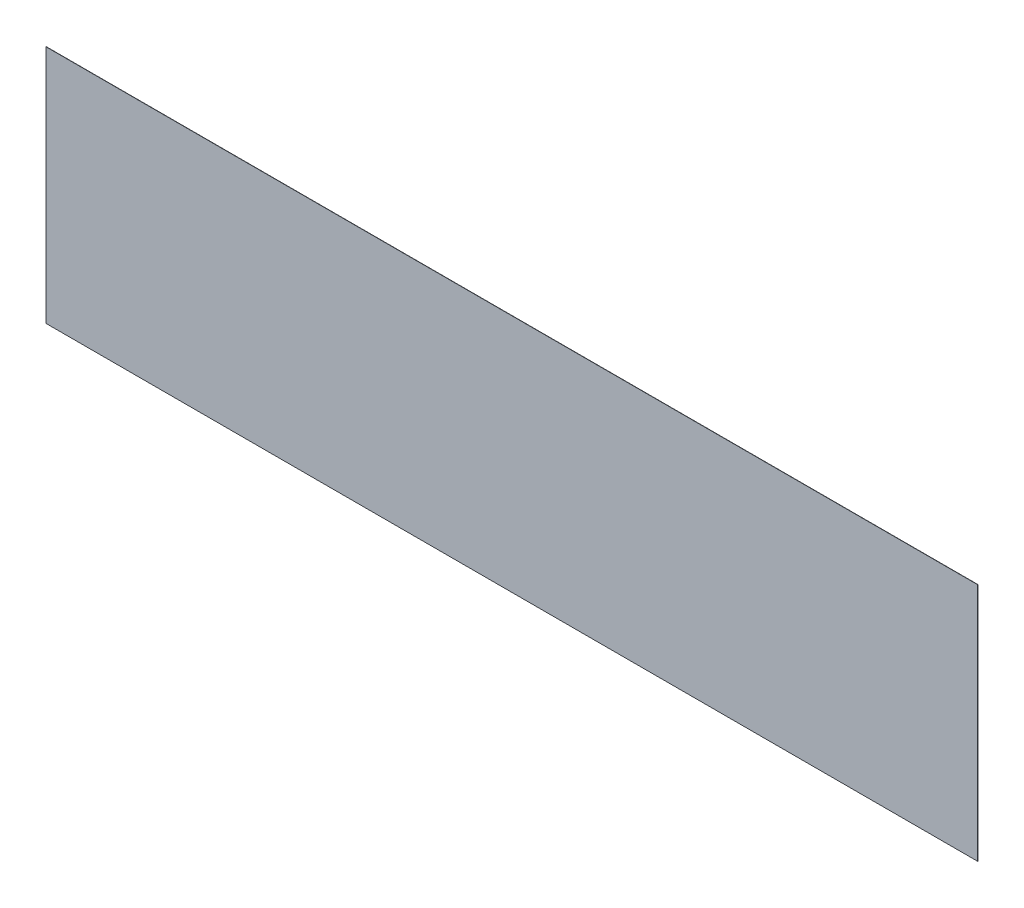
ISO-10303-21;
HEADER;
FILE_DESCRIPTION(('STEP AP214'),'2;1');
FILE_NAME('part.step','',(''),(''),'','','');
FILE_SCHEMA(('AUTOMOTIVE_DESIGN { 1 0 10303 214 1 1 1 1 }'));
ENDSEC;
DATA;
#1=APPLICATION_CONTEXT('core data for automotive mechanical design processes');
#2=APPLICATION_PROTOCOL_DEFINITION('international standard','automotive_design',2000,#1);
#3=PRODUCT_CONTEXT('',#1,'mechanical');
#4=PRODUCT('Part','Part','',(#3));
#5=PRODUCT_RELATED_PRODUCT_CATEGORY('part','',(#4));
#6=PRODUCT_DEFINITION_FORMATION('','',#4);
#7=PRODUCT_DEFINITION_CONTEXT('part definition',#1,'design');
#8=PRODUCT_DEFINITION('design','',#6,#7);
#9=PRODUCT_DEFINITION_SHAPE('','',#8);
#10=(LENGTH_UNIT() NAMED_UNIT(*) SI_UNIT(.MILLI.,.METRE.));
#11=(NAMED_UNIT(*) PLANE_ANGLE_UNIT() SI_UNIT($,.RADIAN.));
#12=(NAMED_UNIT(*) SI_UNIT($,.STERADIAN.) SOLID_ANGLE_UNIT());
#13=UNCERTAINTY_MEASURE_WITH_UNIT(LENGTH_MEASURE(1.E-05),#10,'distance_accuracy_value','');
#14=(GEOMETRIC_REPRESENTATION_CONTEXT(3) GLOBAL_UNCERTAINTY_ASSIGNED_CONTEXT((#13)) GLOBAL_UNIT_ASSIGNED_CONTEXT((#10,
#11,#12)) REPRESENTATION_CONTEXT('',''));
#15=CARTESIAN_POINT('',(0.,0.,0.));
#16=DIRECTION('',(0.,0.,1.));
#17=DIRECTION('',(1.,0.,0.));
#18=AXIS2_PLACEMENT_3D('',#15,#16,#17);
#19=CARTESIAN_POINT('',(0.,0.,0.001));
#20=DIRECTION('',(0.,0.,1.));
#21=DIRECTION('',(1.,0.,0.));
#22=AXIS2_PLACEMENT_3D('',#19,#20,#21);
#23=PLANE('',#22);
#24=DIRECTION('',(0.,1.,0.));
#25=VECTOR('',#24,1.);
#26=CARTESIAN_POINT('',(0.,0.,0.001));
#27=LINE('',#26,#25);
#28=CARTESIAN_POINT('',(0.,0.,0.001));
#29=VERTEX_POINT('',#28);
#30=CARTESIAN_POINT('',(0.,0.9,0.001));
#31=VERTEX_POINT('',#30);
#32=EDGE_CURVE('E75',#29,#31,#27,.T.);
#33=ORIENTED_EDGE('',*,*,#32,.F.);
#34=DIRECTION('',(1.,0.,0.));
#35=VECTOR('',#34,1.);
#36=CARTESIAN_POINT('',(0.,0.,0.001));
#37=LINE('',#36,#35);
#38=CARTESIAN_POINT('',(3.5,0.,0.001));
#39=VERTEX_POINT('',#38);
#40=EDGE_CURVE('E56',#29,#39,#37,.T.);
#41=ORIENTED_EDGE('',*,*,#40,.T.);
#42=DIRECTION('',(0.,1.,0.));
#43=VECTOR('',#42,1.);
#44=CARTESIAN_POINT('',(3.5,0.,0.001));
#45=LINE('',#44,#43);
#46=CARTESIAN_POINT('',(3.5,0.9,0.001));
#47=VERTEX_POINT('',#46);
#48=EDGE_CURVE('E69',#39,#47,#45,.T.);
#49=ORIENTED_EDGE('',*,*,#48,.T.);
#50=DIRECTION('',(1.,0.,0.));
#51=VECTOR('',#50,1.);
#52=CARTESIAN_POINT('',(0.,0.9,0.001));
#53=LINE('',#52,#51);
#54=EDGE_CURVE('E11',#31,#47,#53,.T.);
#55=ORIENTED_EDGE('',*,*,#54,.F.);
#56=EDGE_LOOP('',(#33,#41,#49,#55));
#57=FACE_BOUND('',#56,.T.);
#58=ADVANCED_FACE('F17',(#57),#23,.T.);
#59=CARTESIAN_POINT('',(0.,0.,0.));
#60=DIRECTION('',(0.,0.,1.));
#61=DIRECTION('',(1.,0.,0.));
#62=AXIS2_PLACEMENT_3D('',#59,#60,#61);
#63=PLANE('',#62);
#64=DIRECTION('',(1.,0.,0.));
#65=VECTOR('',#64,1.);
#66=CARTESIAN_POINT('',(0.,0.9,0.));
#67=LINE('',#66,#65);
#68=CARTESIAN_POINT('',(0.,0.9,0.));
#69=VERTEX_POINT('',#68);
#70=CARTESIAN_POINT('',(3.5,0.9,0.));
#71=VERTEX_POINT('',#70);
#72=EDGE_CURVE('E27',#69,#71,#67,.T.);
#73=ORIENTED_EDGE('',*,*,#72,.T.);
#74=DIRECTION('',(0.,1.,0.));
#75=VECTOR('',#74,1.);
#76=CARTESIAN_POINT('',(3.5,0.,0.));
#77=LINE('',#76,#75);
#78=CARTESIAN_POINT('',(3.5,0.,0.));
#79=VERTEX_POINT('',#78);
#80=EDGE_CURVE('E92',#79,#71,#77,.T.);
#81=ORIENTED_EDGE('',*,*,#80,.F.);
#82=DIRECTION('',(1.,0.,0.));
#83=VECTOR('',#82,1.);
#84=CARTESIAN_POINT('',(0.,0.,0.));
#85=LINE('',#84,#83);
#86=CARTESIAN_POINT('',(0.,0.,0.));
#87=VERTEX_POINT('',#86);
#88=EDGE_CURVE('E68',#87,#79,#85,.T.);
#89=ORIENTED_EDGE('',*,*,#88,.F.);
#90=DIRECTION('',(0.,1.,0.));
#91=VECTOR('',#90,1.);
#92=CARTESIAN_POINT('',(0.,0.,0.));
#93=LINE('',#92,#91);
#94=EDGE_CURVE('E77',#87,#69,#93,.T.);
#95=ORIENTED_EDGE('',*,*,#94,.T.);
#96=EDGE_LOOP('',(#73,#81,#89,#95));
#97=FACE_BOUND('',#96,.T.);
#98=ADVANCED_FACE('F110',(#97),#63,.F.);
#99=CARTESIAN_POINT('',(0.,0.9,0.));
#100=DIRECTION('',(0.,1.,0.));
#101=DIRECTION('',(1.,0.,0.));
#102=AXIS2_PLACEMENT_3D('',#99,#100,#101);
#103=PLANE('',#102);
#104=ORIENTED_EDGE('',*,*,#72,.F.);
#105=DIRECTION('',(0.,0.,1.));
#106=VECTOR('',#105,1.);
#107=CARTESIAN_POINT('',(0.,0.9,0.));
#108=LINE('',#107,#106);
#109=EDGE_CURVE('E81',#69,#31,#108,.T.);
#110=ORIENTED_EDGE('',*,*,#109,.T.);
#111=ORIENTED_EDGE('',*,*,#54,.T.);
#112=DIRECTION('',(0.,0.,1.));
#113=VECTOR('',#112,1.);
#114=CARTESIAN_POINT('',(3.5,0.9,0.));
#115=LINE('',#114,#113);
#116=EDGE_CURVE('E89',#71,#47,#115,.T.);
#117=ORIENTED_EDGE('',*,*,#116,.F.);
#118=EDGE_LOOP('',(#104,#110,#111,#117));
#119=FACE_BOUND('',#118,.T.);
#120=ADVANCED_FACE('F114',(#119),#103,.T.);
#121=CARTESIAN_POINT('',(0.,0.,0.));
#122=DIRECTION('',(0.,1.,0.));
#123=DIRECTION('',(1.,0.,0.));
#124=AXIS2_PLACEMENT_3D('',#121,#122,#123);
#125=PLANE('',#124);
#126=DIRECTION('',(0.,0.,1.));
#127=VECTOR('',#126,1.);
#128=CARTESIAN_POINT('',(3.5,0.,0.));
#129=LINE('',#128,#127);
#130=EDGE_CURVE('E63',#79,#39,#129,.T.);
#131=ORIENTED_EDGE('',*,*,#130,.T.);
#132=ORIENTED_EDGE('',*,*,#40,.F.);
#133=DIRECTION('',(0.,0.,1.));
#134=VECTOR('',#133,1.);
#135=CARTESIAN_POINT('',(0.,0.,0.));
#136=LINE('',#135,#134);
#137=EDGE_CURVE('E60',#87,#29,#136,.T.);
#138=ORIENTED_EDGE('',*,*,#137,.F.);
#139=ORIENTED_EDGE('',*,*,#88,.T.);
#140=EDGE_LOOP('',(#131,#132,#138,#139));
#141=FACE_BOUND('',#140,.T.);
#142=ADVANCED_FACE('F58',(#141),#125,.F.);
#143=CARTESIAN_POINT('',(3.5,0.,0.));
#144=DIRECTION('',(1.,0.,0.));
#145=DIRECTION('',(0.,1.,0.));
#146=AXIS2_PLACEMENT_3D('',#143,#144,#145);
#147=PLANE('',#146);
#148=ORIENTED_EDGE('',*,*,#130,.F.);
#149=ORIENTED_EDGE('',*,*,#80,.T.);
#150=ORIENTED_EDGE('',*,*,#116,.T.);
#151=ORIENTED_EDGE('',*,*,#48,.F.);
#152=EDGE_LOOP('',(#148,#149,#150,#151));
#153=FACE_BOUND('',#152,.T.);
#154=ADVANCED_FACE('F19',(#153),#147,.T.);
#155=CARTESIAN_POINT('',(0.,0.,0.));
#156=DIRECTION('',(1.,0.,0.));
#157=DIRECTION('',(0.,1.,0.));
#158=AXIS2_PLACEMENT_3D('',#155,#156,#157);
#159=PLANE('',#158);
#160=ORIENTED_EDGE('',*,*,#32,.T.);
#161=ORIENTED_EDGE('',*,*,#109,.F.);
#162=ORIENTED_EDGE('',*,*,#94,.F.);
#163=ORIENTED_EDGE('',*,*,#137,.T.);
#164=EDGE_LOOP('',(#160,#161,#162,#163));
#165=FACE_BOUND('',#164,.T.);
#166=ADVANCED_FACE('F73',(#165),#159,.F.);
#167=CLOSED_SHELL('',(#58,#98,#120,#142,#154,#166));
#168=MANIFOLD_SOLID_BREP('B1',#167);
#169=ADVANCED_BREP_SHAPE_REPRESENTATION('',(#18,#168),#14);
#170=SHAPE_DEFINITION_REPRESENTATION(#9,#169);
ENDSEC;
END-ISO-10303-21;
